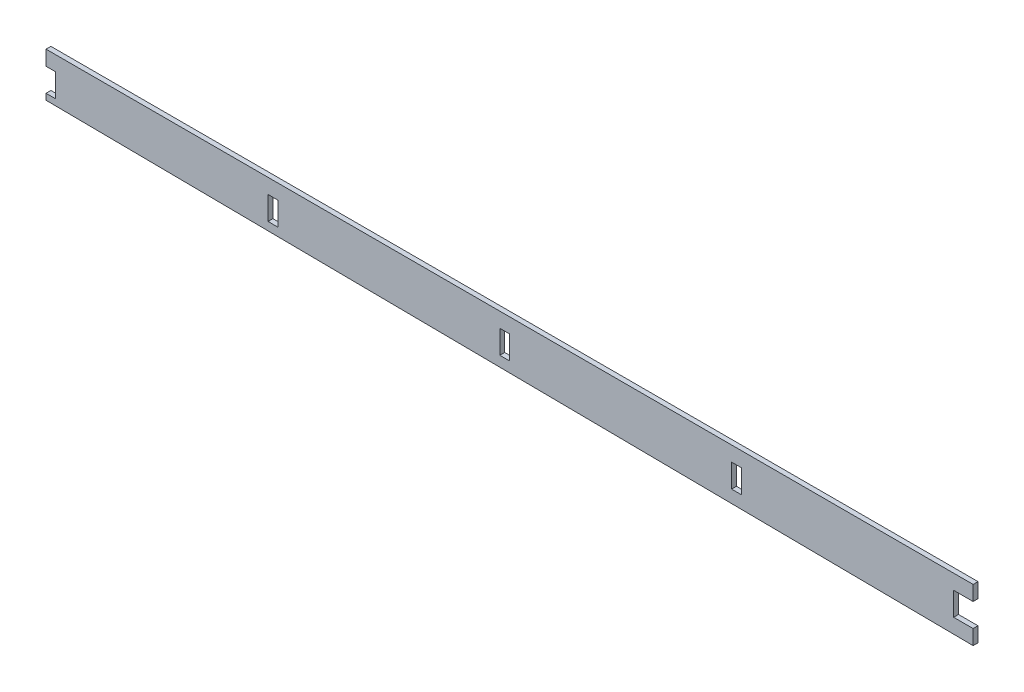
ISO-10303-21;
HEADER;
FILE_DESCRIPTION(('STEP AP214'),'2;1');
FILE_NAME('part.step','',(''),(''),'','','');
FILE_SCHEMA(('AUTOMOTIVE_DESIGN { 1 0 10303 214 1 1 1 1 }'));
ENDSEC;
DATA;
#1=APPLICATION_CONTEXT('core data for automotive mechanical design processes');
#2=APPLICATION_PROTOCOL_DEFINITION('international standard','automotive_design',2000,#1);
#3=PRODUCT_CONTEXT('',#1,'mechanical');
#4=PRODUCT('Part','Part','',(#3));
#5=PRODUCT_RELATED_PRODUCT_CATEGORY('part','',(#4));
#6=PRODUCT_DEFINITION_FORMATION('','',#4);
#7=PRODUCT_DEFINITION_CONTEXT('part definition',#1,'design');
#8=PRODUCT_DEFINITION('design','',#6,#7);
#9=PRODUCT_DEFINITION_SHAPE('','',#8);
#10=(LENGTH_UNIT() NAMED_UNIT(*) SI_UNIT(.MILLI.,.METRE.));
#11=(NAMED_UNIT(*) PLANE_ANGLE_UNIT() SI_UNIT($,.RADIAN.));
#12=(NAMED_UNIT(*) SI_UNIT($,.STERADIAN.) SOLID_ANGLE_UNIT());
#13=UNCERTAINTY_MEASURE_WITH_UNIT(LENGTH_MEASURE(1.E-05),#10,'distance_accuracy_value','');
#14=(GEOMETRIC_REPRESENTATION_CONTEXT(3) GLOBAL_UNCERTAINTY_ASSIGNED_CONTEXT((#13)) GLOBAL_UNIT_ASSIGNED_CONTEXT((#10,
#11,#12)) REPRESENTATION_CONTEXT('',''));
#15=CARTESIAN_POINT('',(0.,0.,0.));
#16=DIRECTION('',(0.,0.,1.));
#17=DIRECTION('',(1.,0.,0.));
#18=AXIS2_PLACEMENT_3D('',#15,#16,#17);
#19=CARTESIAN_POINT('',(0.,0.,1.5875));
#20=DIRECTION('',(0.,0.,-1.));
#21=DIRECTION('',(-1.,0.,0.));
#22=AXIS2_PLACEMENT_3D('',#19,#20,#21);
#23=PLANE('',#22);
#24=DIRECTION('',(0.,-1.,0.));
#25=VECTOR('',#24,1.);
#26=CARTESIAN_POINT('',(-65.9792565693098,-35.892525905535,1.5875));
#27=LINE('',#26,#25);
#28=CARTESIAN_POINT('',(-65.9792565693098,-35.892525905535,1.5875));
#29=VERTEX_POINT('',#28);
#30=CARTESIAN_POINT('',(-65.9792565693099,-43.512525905535,1.5875));
#31=VERTEX_POINT('',#30);
#32=EDGE_CURVE('E229',#29,#31,#27,.T.);
#33=ORIENTED_EDGE('',*,*,#32,.F.);
#34=DIRECTION('',(-1.,0.,0.));
#35=VECTOR('',#34,1.);
#36=CARTESIAN_POINT('',(-62.8042565693099,-35.892525905535,1.5875));
#37=LINE('',#36,#35);
#38=CARTESIAN_POINT('',(-62.8042565693099,-35.892525905535,1.5875));
#39=VERTEX_POINT('',#38);
#40=EDGE_CURVE('E237',#39,#29,#37,.T.);
#41=ORIENTED_EDGE('',*,*,#40,.F.);
#42=DIRECTION('',(0.,1.,0.));
#43=VECTOR('',#42,1.);
#44=CARTESIAN_POINT('',(-62.8042565693098,-43.512525905535,1.5875));
#45=LINE('',#44,#43);
#46=CARTESIAN_POINT('',(-62.8042565693098,-43.512525905535,1.5875));
#47=VERTEX_POINT('',#46);
#48=EDGE_CURVE('E234',#47,#39,#45,.T.);
#49=ORIENTED_EDGE('',*,*,#48,.F.);
#50=DIRECTION('',(1.,0.,0.));
#51=VECTOR('',#50,1.);
#52=CARTESIAN_POINT('',(-65.9792565693099,-43.512525905535,1.5875));
#53=LINE('',#52,#51);
#54=EDGE_CURVE('E231',#31,#47,#53,.T.);
#55=ORIENTED_EDGE('',*,*,#54,.F.);
#56=EDGE_LOOP('',(#33,#41,#49,#55));
#57=FACE_BOUND('',#56,.T.);
#58=DIRECTION('',(-1.,0.,0.));
#59=VECTOR('',#58,1.);
#60=CARTESIAN_POINT('',(81.9757434306901,-43.512525905535,1.5875));
#61=LINE('',#60,#59);
#62=CARTESIAN_POINT('',(88.3257434306901,-43.512525905535,1.5875));
#63=VERTEX_POINT('',#62);
#64=CARTESIAN_POINT('',(81.9757434306901,-43.512525905535,1.5875));
#65=VERTEX_POINT('',#64);
#66=EDGE_CURVE('E291',#63,#65,#61,.T.);
#67=ORIENTED_EDGE('',*,*,#66,.T.);
#68=DIRECTION('',(0.,1.,0.));
#69=VECTOR('',#68,1.);
#70=CARTESIAN_POINT('',(81.9757434306901,-43.512525905535,1.5875));
#71=LINE('',#70,#69);
#72=CARTESIAN_POINT('',(81.9757434306901,-35.892525905535,1.5875));
#73=VERTEX_POINT('',#72);
#74=EDGE_CURVE('E294',#65,#73,#71,.T.);
#75=ORIENTED_EDGE('',*,*,#74,.T.);
#76=DIRECTION('',(1.,0.,0.));
#77=VECTOR('',#76,1.);
#78=CARTESIAN_POINT('',(81.9757434306901,-35.892525905535,1.5875));
#79=LINE('',#78,#77);
#80=CARTESIAN_POINT('',(88.3257434306901,-35.892525905535,1.5875));
#81=VERTEX_POINT('',#80);
#82=EDGE_CURVE('E297',#73,#81,#79,.T.);
#83=ORIENTED_EDGE('',*,*,#82,.T.);
#84=DIRECTION('',(0.,1.,0.));
#85=VECTOR('',#84,1.);
#86=CARTESIAN_POINT('',(88.3257434306901,-35.892525905535,1.5875));
#87=LINE('',#86,#85);
#88=CARTESIAN_POINT('',(88.3257434306901,-31.0535940441647,1.5875));
#89=VERTEX_POINT('',#88);
#90=EDGE_CURVE('E299',#81,#89,#87,.T.);
#91=ORIENTED_EDGE('',*,*,#90,.T.);
#92=DIRECTION('',(-1.,0.,0.));
#93=VECTOR('',#92,1.);
#94=CARTESIAN_POINT('',(88.3257434306901,-31.0535940441647,1.5875));
#95=LINE('',#94,#93);
#96=CARTESIAN_POINT('',(-213.93425656931,-31.0535940441647,1.5875));
#97=VERTEX_POINT('',#96);
#98=EDGE_CURVE('E301',#89,#97,#95,.T.);
#99=ORIENTED_EDGE('',*,*,#98,.T.);
#100=DIRECTION('',(0.,-1.,0.));
#101=VECTOR('',#100,1.);
#102=CARTESIAN_POINT('',(-213.93425656931,-35.892525905535,1.5875));
#103=LINE('',#102,#101);
#104=CARTESIAN_POINT('',(-213.93425656931,-35.892525905535,1.5875));
#105=VERTEX_POINT('',#104);
#106=EDGE_CURVE('E303',#97,#105,#103,.T.);
#107=ORIENTED_EDGE('',*,*,#106,.T.);
#108=DIRECTION('',(1.,0.,0.));
#109=VECTOR('',#108,1.);
#110=CARTESIAN_POINT('',(-210.75925656931,-35.892525905535,1.5875));
#111=LINE('',#110,#109);
#112=CARTESIAN_POINT('',(-210.75925656931,-35.892525905535,1.5875));
#113=VERTEX_POINT('',#112);
#114=EDGE_CURVE('E305',#105,#113,#111,.T.);
#115=ORIENTED_EDGE('',*,*,#114,.T.);
#116=DIRECTION('',(0.,-1.,0.));
#117=VECTOR('',#116,1.);
#118=CARTESIAN_POINT('',(-210.75925656931,-43.512525905535,1.5875));
#119=LINE('',#118,#117);
#120=CARTESIAN_POINT('',(-210.75925656931,-43.512525905535,1.5875));
#121=VERTEX_POINT('',#120);
#122=EDGE_CURVE('E307',#113,#121,#119,.T.);
#123=ORIENTED_EDGE('',*,*,#122,.T.);
#124=DIRECTION('',(-1.,0.,0.));
#125=VECTOR('',#124,1.);
#126=CARTESIAN_POINT('',(-213.93425656931,-43.512525905535,1.5875));
#127=LINE('',#126,#125);
#128=CARTESIAN_POINT('',(-213.93425656931,-43.512525905535,1.5875));
#129=VERTEX_POINT('',#128);
#130=EDGE_CURVE('E309',#121,#129,#127,.T.);
#131=ORIENTED_EDGE('',*,*,#130,.T.);
#132=DIRECTION('',(1.12806988141054E-13,-1.,0.));
#133=VECTOR('',#132,1.);
#134=CARTESIAN_POINT('',(-213.93425656931,-45.480884502676,1.5875));
#135=LINE('',#134,#133);
#136=CARTESIAN_POINT('',(-213.93425656931,-45.480884502676,1.5875));
#137=VERTEX_POINT('',#136);
#138=EDGE_CURVE('E311',#129,#137,#135,.T.);
#139=ORIENTED_EDGE('',*,*,#138,.T.);
#140=DIRECTION('',(0.999954907890458,-0.00949643016011447,0.));
#141=VECTOR('',#140,1.);
#142=CARTESIAN_POINT('',(88.3257434306901,-48.3514049206934,1.5875));
#143=LINE('',#142,#141);
#144=CARTESIAN_POINT('',(88.3257434306901,-48.3514049206934,1.5875));
#145=VERTEX_POINT('',#144);
#146=EDGE_CURVE('E313',#137,#145,#143,.T.);
#147=ORIENTED_EDGE('',*,*,#146,.T.);
#148=DIRECTION('',(0.,1.,0.));
#149=VECTOR('',#148,1.);
#150=CARTESIAN_POINT('',(88.3257434306901,-43.512525905535,1.5875));
#151=LINE('',#150,#149);
#152=EDGE_CURVE('E315',#145,#63,#151,.T.);
#153=ORIENTED_EDGE('',*,*,#152,.T.);
#154=EDGE_LOOP('',(#67,#75,#83,#91,#99,#107,#115,#123,#131,#139,#147,#153));
#155=FACE_BOUND('',#154,.T.);
#156=DIRECTION('',(1.,0.,0.));
#157=VECTOR('',#156,1.);
#158=CARTESIAN_POINT('',(9.5857434306901,-43.512525905535,1.5875));
#159=LINE('',#158,#157);
#160=CARTESIAN_POINT('',(9.5857434306901,-43.512525905535,1.5875));
#161=VERTEX_POINT('',#160);
#162=CARTESIAN_POINT('',(12.7607434306901,-43.512525905535,1.5875));
#163=VERTEX_POINT('',#162);
#164=EDGE_CURVE('E260',#161,#163,#159,.T.);
#165=ORIENTED_EDGE('',*,*,#164,.F.);
#166=DIRECTION('',(0.,-1.,0.));
#167=VECTOR('',#166,1.);
#168=CARTESIAN_POINT('',(9.5857434306901,-35.892525905535,1.5875));
#169=LINE('',#168,#167);
#170=CARTESIAN_POINT('',(9.5857434306901,-35.892525905535,1.5875));
#171=VERTEX_POINT('',#170);
#172=EDGE_CURVE('E268',#171,#161,#169,.T.);
#173=ORIENTED_EDGE('',*,*,#172,.F.);
#174=DIRECTION('',(-1.,0.,0.));
#175=VECTOR('',#174,1.);
#176=CARTESIAN_POINT('',(12.7607434306901,-35.8925259055349,1.5875));
#177=LINE('',#176,#175);
#178=CARTESIAN_POINT('',(12.7607434306901,-35.8925259055349,1.5875));
#179=VERTEX_POINT('',#178);
#180=EDGE_CURVE('E265',#179,#171,#177,.T.);
#181=ORIENTED_EDGE('',*,*,#180,.F.);
#182=DIRECTION('',(0.,1.,0.));
#183=VECTOR('',#182,1.);
#184=CARTESIAN_POINT('',(12.7607434306901,-43.512525905535,1.5875));
#185=LINE('',#184,#183);
#186=EDGE_CURVE('E262',#163,#179,#185,.T.);
#187=ORIENTED_EDGE('',*,*,#186,.F.);
#188=EDGE_LOOP('',(#165,#173,#181,#187));
#189=FACE_BOUND('',#188,.T.);
#190=DIRECTION('',(0.,-1.,0.));
#191=VECTOR('',#190,1.);
#192=CARTESIAN_POINT('',(-141.54425656931,-35.892525905535,1.5875));
#193=LINE('',#192,#191);
#194=CARTESIAN_POINT('',(-141.54425656931,-35.892525905535,1.5875));
#195=VERTEX_POINT('',#194);
#196=CARTESIAN_POINT('',(-141.54425656931,-43.512525905535,1.5875));
#197=VERTEX_POINT('',#196);
#198=EDGE_CURVE('E193',#195,#197,#193,.T.);
#199=ORIENTED_EDGE('',*,*,#198,.F.);
#200=DIRECTION('',(-1.,0.,0.));
#201=VECTOR('',#200,1.);
#202=CARTESIAN_POINT('',(-138.36925656931,-35.892525905535,1.5875));
#203=LINE('',#202,#201);
#204=CARTESIAN_POINT('',(-138.36925656931,-35.892525905535,1.5875));
#205=VERTEX_POINT('',#204);
#206=EDGE_CURVE('E215',#205,#195,#203,.T.);
#207=ORIENTED_EDGE('',*,*,#206,.F.);
#208=DIRECTION('',(0.,1.,0.));
#209=VECTOR('',#208,1.);
#210=CARTESIAN_POINT('',(-138.36925656931,-43.512525905535,1.5875));
#211=LINE('',#210,#209);
#212=CARTESIAN_POINT('',(-138.36925656931,-43.512525905535,1.5875));
#213=VERTEX_POINT('',#212);
#214=EDGE_CURVE('E213',#213,#205,#211,.T.);
#215=ORIENTED_EDGE('',*,*,#214,.F.);
#216=DIRECTION('',(1.,0.,0.));
#217=VECTOR('',#216,1.);
#218=CARTESIAN_POINT('',(-141.54425656931,-43.512525905535,1.5875));
#219=LINE('',#218,#217);
#220=EDGE_CURVE('E201',#197,#213,#219,.T.);
#221=ORIENTED_EDGE('',*,*,#220,.F.);
#222=EDGE_LOOP('',(#199,#207,#215,#221));
#223=FACE_BOUND('',#222,.T.);
#224=ADVANCED_FACE('F32',(#57,#155,#189,#223),#23,.F.);
#225=CARTESIAN_POINT('',(0.,0.,0.));
#226=DIRECTION('',(0.,0.,-1.));
#227=DIRECTION('',(-1.,0.,0.));
#228=AXIS2_PLACEMENT_3D('',#225,#226,#227);
#229=PLANE('',#228);
#230=DIRECTION('',(-1.,0.,0.));
#231=VECTOR('',#230,1.);
#232=CARTESIAN_POINT('',(81.9757434306901,-43.512525905535,0.));
#233=LINE('',#232,#231);
#234=CARTESIAN_POINT('',(88.3257434306901,-43.512525905535,0.));
#235=VERTEX_POINT('',#234);
#236=CARTESIAN_POINT('',(81.9757434306901,-43.512525905535,0.));
#237=VERTEX_POINT('',#236);
#238=EDGE_CURVE('E290',#235,#237,#233,.T.);
#239=ORIENTED_EDGE('',*,*,#238,.F.);
#240=DIRECTION('',(0.,1.,0.));
#241=VECTOR('',#240,1.);
#242=CARTESIAN_POINT('',(88.3257434306901,-43.512525905535,0.));
#243=LINE('',#242,#241);
#244=CARTESIAN_POINT('',(88.3257434306901,-48.3514049206934,0.));
#245=VERTEX_POINT('',#244);
#246=EDGE_CURVE('E295',#245,#235,#243,.T.);
#247=ORIENTED_EDGE('',*,*,#246,.F.);
#248=DIRECTION('',(0.999954907890458,-0.00949643016011447,0.));
#249=VECTOR('',#248,1.);
#250=CARTESIAN_POINT('',(88.3257434306901,-48.3514049206934,0.));
#251=LINE('',#250,#249);
#252=CARTESIAN_POINT('',(-213.93425656931,-45.480884502676,0.));
#253=VERTEX_POINT('',#252);
#254=EDGE_CURVE('E338',#253,#245,#251,.T.);
#255=ORIENTED_EDGE('',*,*,#254,.F.);
#256=DIRECTION('',(1.12806988141054E-13,-1.,0.));
#257=VECTOR('',#256,1.);
#258=CARTESIAN_POINT('',(-213.93425656931,-45.480884502676,0.));
#259=LINE('',#258,#257);
#260=CARTESIAN_POINT('',(-213.93425656931,-43.512525905535,0.));
#261=VERTEX_POINT('',#260);
#262=EDGE_CURVE('E336',#261,#253,#259,.T.);
#263=ORIENTED_EDGE('',*,*,#262,.F.);
#264=DIRECTION('',(-1.,0.,0.));
#265=VECTOR('',#264,1.);
#266=CARTESIAN_POINT('',(-213.93425656931,-43.512525905535,0.));
#267=LINE('',#266,#265);
#268=CARTESIAN_POINT('',(-210.75925656931,-43.512525905535,0.));
#269=VERTEX_POINT('',#268);
#270=EDGE_CURVE('E334',#269,#261,#267,.T.);
#271=ORIENTED_EDGE('',*,*,#270,.F.);
#272=DIRECTION('',(0.,-1.,0.));
#273=VECTOR('',#272,1.);
#274=CARTESIAN_POINT('',(-210.75925656931,-43.512525905535,0.));
#275=LINE('',#274,#273);
#276=CARTESIAN_POINT('',(-210.75925656931,-35.892525905535,0.));
#277=VERTEX_POINT('',#276);
#278=EDGE_CURVE('E332',#277,#269,#275,.T.);
#279=ORIENTED_EDGE('',*,*,#278,.F.);
#280=DIRECTION('',(1.,0.,0.));
#281=VECTOR('',#280,1.);
#282=CARTESIAN_POINT('',(-210.75925656931,-35.892525905535,0.));
#283=LINE('',#282,#281);
#284=CARTESIAN_POINT('',(-213.93425656931,-35.892525905535,0.));
#285=VERTEX_POINT('',#284);
#286=EDGE_CURVE('E330',#285,#277,#283,.T.);
#287=ORIENTED_EDGE('',*,*,#286,.F.);
#288=DIRECTION('',(0.,-1.,0.));
#289=VECTOR('',#288,1.);
#290=CARTESIAN_POINT('',(-213.93425656931,-35.892525905535,0.));
#291=LINE('',#290,#289);
#292=CARTESIAN_POINT('',(-213.93425656931,-31.0535940441647,0.));
#293=VERTEX_POINT('',#292);
#294=EDGE_CURVE('E328',#293,#285,#291,.T.);
#295=ORIENTED_EDGE('',*,*,#294,.F.);
#296=DIRECTION('',(-1.,0.,0.));
#297=VECTOR('',#296,1.);
#298=CARTESIAN_POINT('',(88.3257434306901,-31.0535940441647,0.));
#299=LINE('',#298,#297);
#300=CARTESIAN_POINT('',(88.3257434306901,-31.0535940441647,0.));
#301=VERTEX_POINT('',#300);
#302=EDGE_CURVE('E326',#301,#293,#299,.T.);
#303=ORIENTED_EDGE('',*,*,#302,.F.);
#304=DIRECTION('',(0.,1.,0.));
#305=VECTOR('',#304,1.);
#306=CARTESIAN_POINT('',(88.3257434306901,-35.892525905535,0.));
#307=LINE('',#306,#305);
#308=CARTESIAN_POINT('',(88.3257434306901,-35.892525905535,0.));
#309=VERTEX_POINT('',#308);
#310=EDGE_CURVE('E324',#309,#301,#307,.T.);
#311=ORIENTED_EDGE('',*,*,#310,.F.);
#312=DIRECTION('',(1.,0.,0.));
#313=VECTOR('',#312,1.);
#314=CARTESIAN_POINT('',(81.9757434306901,-35.892525905535,0.));
#315=LINE('',#314,#313);
#316=CARTESIAN_POINT('',(81.9757434306901,-35.892525905535,0.));
#317=VERTEX_POINT('',#316);
#318=EDGE_CURVE('E322',#317,#309,#315,.T.);
#319=ORIENTED_EDGE('',*,*,#318,.F.);
#320=DIRECTION('',(0.,1.,0.));
#321=VECTOR('',#320,1.);
#322=CARTESIAN_POINT('',(81.9757434306901,-43.512525905535,0.));
#323=LINE('',#322,#321);
#324=EDGE_CURVE('E320',#237,#317,#323,.T.);
#325=ORIENTED_EDGE('',*,*,#324,.F.);
#326=EDGE_LOOP('',(#239,#247,#255,#263,#271,#279,#287,#295,#303,#311,#319,#325));
#327=FACE_BOUND('',#326,.T.);
#328=DIRECTION('',(0.,-1.,0.));
#329=VECTOR('',#328,1.);
#330=CARTESIAN_POINT('',(9.5857434306901,-35.892525905535,0.));
#331=LINE('',#330,#329);
#332=CARTESIAN_POINT('',(9.5857434306901,-35.892525905535,0.));
#333=VERTEX_POINT('',#332);
#334=CARTESIAN_POINT('',(9.5857434306901,-43.512525905535,0.));
#335=VERTEX_POINT('',#334);
#336=EDGE_CURVE('E263',#333,#335,#331,.T.);
#337=ORIENTED_EDGE('',*,*,#336,.T.);
#338=DIRECTION('',(1.,0.,0.));
#339=VECTOR('',#338,1.);
#340=CARTESIAN_POINT('',(9.5857434306901,-43.512525905535,0.));
#341=LINE('',#340,#339);
#342=CARTESIAN_POINT('',(12.7607434306901,-43.512525905535,0.));
#343=VERTEX_POINT('',#342);
#344=EDGE_CURVE('E259',#335,#343,#341,.T.);
#345=ORIENTED_EDGE('',*,*,#344,.T.);
#346=DIRECTION('',(0.,1.,0.));
#347=VECTOR('',#346,1.);
#348=CARTESIAN_POINT('',(12.7607434306901,-43.512525905535,0.));
#349=LINE('',#348,#347);
#350=CARTESIAN_POINT('',(12.7607434306901,-35.8925259055349,0.));
#351=VERTEX_POINT('',#350);
#352=EDGE_CURVE('E273',#343,#351,#349,.T.);
#353=ORIENTED_EDGE('',*,*,#352,.T.);
#354=DIRECTION('',(-1.,0.,0.));
#355=VECTOR('',#354,1.);
#356=CARTESIAN_POINT('',(12.7607434306901,-35.8925259055349,0.));
#357=LINE('',#356,#355);
#358=EDGE_CURVE('E276',#351,#333,#357,.T.);
#359=ORIENTED_EDGE('',*,*,#358,.T.);
#360=EDGE_LOOP('',(#337,#345,#353,#359));
#361=FACE_BOUND('',#360,.T.);
#362=DIRECTION('',(-1.,0.,0.));
#363=VECTOR('',#362,1.);
#364=CARTESIAN_POINT('',(-62.8042565693099,-35.892525905535,0.));
#365=LINE('',#364,#363);
#366=CARTESIAN_POINT('',(-62.8042565693099,-35.892525905535,0.));
#367=VERTEX_POINT('',#366);
#368=CARTESIAN_POINT('',(-65.9792565693098,-35.892525905535,0.));
#369=VERTEX_POINT('',#368);
#370=EDGE_CURVE('E232',#367,#369,#365,.T.);
#371=ORIENTED_EDGE('',*,*,#370,.T.);
#372=DIRECTION('',(0.,-1.,0.));
#373=VECTOR('',#372,1.);
#374=CARTESIAN_POINT('',(-65.9792565693098,-35.892525905535,0.));
#375=LINE('',#374,#373);
#376=CARTESIAN_POINT('',(-65.9792565693099,-43.512525905535,0.));
#377=VERTEX_POINT('',#376);
#378=EDGE_CURVE('E209',#369,#377,#375,.T.);
#379=ORIENTED_EDGE('',*,*,#378,.T.);
#380=DIRECTION('',(1.,0.,0.));
#381=VECTOR('',#380,1.);
#382=CARTESIAN_POINT('',(-65.9792565693099,-43.512525905535,0.));
#383=LINE('',#382,#381);
#384=CARTESIAN_POINT('',(-62.8042565693098,-43.512525905535,0.));
#385=VERTEX_POINT('',#384);
#386=EDGE_CURVE('E242',#377,#385,#383,.T.);
#387=ORIENTED_EDGE('',*,*,#386,.T.);
#388=DIRECTION('',(0.,1.,0.));
#389=VECTOR('',#388,1.);
#390=CARTESIAN_POINT('',(-62.8042565693098,-43.512525905535,0.));
#391=LINE('',#390,#389);
#392=EDGE_CURVE('E245',#385,#367,#391,.T.);
#393=ORIENTED_EDGE('',*,*,#392,.T.);
#394=EDGE_LOOP('',(#371,#379,#387,#393));
#395=FACE_BOUND('',#394,.T.);
#396=DIRECTION('',(-1.,0.,0.));
#397=VECTOR('',#396,1.);
#398=CARTESIAN_POINT('',(-138.36925656931,-35.892525905535,0.));
#399=LINE('',#398,#397);
#400=CARTESIAN_POINT('',(-138.36925656931,-35.892525905535,0.));
#401=VERTEX_POINT('',#400);
#402=CARTESIAN_POINT('',(-141.54425656931,-35.892525905535,0.));
#403=VERTEX_POINT('',#402);
#404=EDGE_CURVE('E202',#401,#403,#399,.T.);
#405=ORIENTED_EDGE('',*,*,#404,.T.);
#406=DIRECTION('',(0.,-1.,0.));
#407=VECTOR('',#406,1.);
#408=CARTESIAN_POINT('',(-141.54425656931,-35.892525905535,0.));
#409=LINE('',#408,#407);
#410=CARTESIAN_POINT('',(-141.54425656931,-43.512525905535,0.));
#411=VERTEX_POINT('',#410);
#412=EDGE_CURVE('E55',#403,#411,#409,.T.);
#413=ORIENTED_EDGE('',*,*,#412,.T.);
#414=DIRECTION('',(1.,0.,0.));
#415=VECTOR('',#414,1.);
#416=CARTESIAN_POINT('',(-141.54425656931,-43.512525905535,0.));
#417=LINE('',#416,#415);
#418=CARTESIAN_POINT('',(-138.36925656931,-43.512525905535,0.));
#419=VERTEX_POINT('',#418);
#420=EDGE_CURVE('E208',#411,#419,#417,.T.);
#421=ORIENTED_EDGE('',*,*,#420,.T.);
#422=DIRECTION('',(0.,1.,0.));
#423=VECTOR('',#422,1.);
#424=CARTESIAN_POINT('',(-138.36925656931,-43.512525905535,0.));
#425=LINE('',#424,#423);
#426=EDGE_CURVE('E221',#419,#401,#425,.T.);
#427=ORIENTED_EDGE('',*,*,#426,.T.);
#428=EDGE_LOOP('',(#405,#413,#421,#427));
#429=FACE_BOUND('',#428,.T.);
#430=ADVANCED_FACE('F380',(#327,#361,#395,#429),#229,.T.);
#431=CARTESIAN_POINT('',(81.9757434306901,-43.512525905535,1.5875));
#432=DIRECTION('',(0.,-1.,0.));
#433=DIRECTION('',(1.,0.,0.));
#434=AXIS2_PLACEMENT_3D('',#431,#432,#433);
#435=PLANE('',#434);
#436=ORIENTED_EDGE('',*,*,#238,.T.);
#437=DIRECTION('',(0.,0.,-1.));
#438=VECTOR('',#437,1.);
#439=CARTESIAN_POINT('',(81.9757434306901,-43.512525905535,1.5875));
#440=LINE('',#439,#438);
#441=EDGE_CURVE('E11',#65,#237,#440,.T.);
#442=ORIENTED_EDGE('',*,*,#441,.F.);
#443=ORIENTED_EDGE('',*,*,#66,.F.);
#444=DIRECTION('',(0.,0.,-1.));
#445=VECTOR('',#444,1.);
#446=CARTESIAN_POINT('',(88.3257434306901,-43.512525905535,1.5875));
#447=LINE('',#446,#445);
#448=EDGE_CURVE('E317',#63,#235,#447,.T.);
#449=ORIENTED_EDGE('',*,*,#448,.T.);
#450=EDGE_LOOP('',(#436,#442,#443,#449));
#451=FACE_BOUND('',#450,.T.);
#452=ADVANCED_FACE('F34',(#451),#435,.F.);
#453=CARTESIAN_POINT('',(81.9757434306901,-43.512525905535,1.5875));
#454=DIRECTION('',(-1.,0.,0.));
#455=DIRECTION('',(0.,0.,1.));
#456=AXIS2_PLACEMENT_3D('',#453,#454,#455);
#457=PLANE('',#456);
#458=ORIENTED_EDGE('',*,*,#324,.T.);
#459=DIRECTION('',(0.,0.,-1.));
#460=VECTOR('',#459,1.);
#461=CARTESIAN_POINT('',(81.9757434306901,-35.892525905535,1.5875));
#462=LINE('',#461,#460);
#463=EDGE_CURVE('E40',#73,#317,#462,.T.);
#464=ORIENTED_EDGE('',*,*,#463,.F.);
#465=ORIENTED_EDGE('',*,*,#74,.F.);
#466=ORIENTED_EDGE('',*,*,#441,.T.);
#467=EDGE_LOOP('',(#458,#464,#465,#466));
#468=FACE_BOUND('',#467,.T.);
#469=ADVANCED_FACE('F398',(#468),#457,.F.);
#470=CARTESIAN_POINT('',(81.9757434306901,-35.892525905535,1.5875));
#471=DIRECTION('',(0.,1.,0.));
#472=DIRECTION('',(0.,0.,1.));
#473=AXIS2_PLACEMENT_3D('',#470,#471,#472);
#474=PLANE('',#473);
#475=ORIENTED_EDGE('',*,*,#318,.T.);
#476=DIRECTION('',(0.,0.,-1.));
#477=VECTOR('',#476,1.);
#478=CARTESIAN_POINT('',(88.3257434306901,-35.892525905535,1.5875));
#479=LINE('',#478,#477);
#480=EDGE_CURVE('E367',#81,#309,#479,.T.);
#481=ORIENTED_EDGE('',*,*,#480,.F.);
#482=ORIENTED_EDGE('',*,*,#82,.F.);
#483=ORIENTED_EDGE('',*,*,#463,.T.);
#484=EDGE_LOOP('',(#475,#481,#482,#483));
#485=FACE_BOUND('',#484,.T.);
#486=ADVANCED_FACE('F374',(#485),#474,.F.);
#487=CARTESIAN_POINT('',(88.3257434306901,-35.892525905535,1.5875));
#488=DIRECTION('',(-1.,0.,0.));
#489=DIRECTION('',(0.,0.,1.));
#490=AXIS2_PLACEMENT_3D('',#487,#488,#489);
#491=PLANE('',#490);
#492=ORIENTED_EDGE('',*,*,#310,.T.);
#493=DIRECTION('',(0.,0.,-1.));
#494=VECTOR('',#493,1.);
#495=CARTESIAN_POINT('',(88.3257434306901,-31.0535940441647,1.5875));
#496=LINE('',#495,#494);
#497=EDGE_CURVE('E364',#89,#301,#496,.T.);
#498=ORIENTED_EDGE('',*,*,#497,.F.);
#499=ORIENTED_EDGE('',*,*,#90,.F.);
#500=ORIENTED_EDGE('',*,*,#480,.T.);
#501=EDGE_LOOP('',(#492,#498,#499,#500));
#502=FACE_BOUND('',#501,.T.);
#503=ADVANCED_FACE('F386',(#502),#491,.F.);
#504=CARTESIAN_POINT('',(88.3257434306901,-31.0535940441647,1.5875));
#505=DIRECTION('',(0.,-1.,0.));
#506=DIRECTION('',(1.,0.,0.));
#507=AXIS2_PLACEMENT_3D('',#504,#505,#506);
#508=PLANE('',#507);
#509=ORIENTED_EDGE('',*,*,#302,.T.);
#510=DIRECTION('',(0.,0.,-1.));
#511=VECTOR('',#510,1.);
#512=CARTESIAN_POINT('',(-213.93425656931,-31.0535940441647,1.5875));
#513=LINE('',#512,#511);
#514=EDGE_CURVE('E361',#97,#293,#513,.T.);
#515=ORIENTED_EDGE('',*,*,#514,.F.);
#516=ORIENTED_EDGE('',*,*,#98,.F.);
#517=ORIENTED_EDGE('',*,*,#497,.T.);
#518=EDGE_LOOP('',(#509,#515,#516,#517));
#519=FACE_BOUND('',#518,.T.);
#520=ADVANCED_FACE('F390',(#519),#508,.F.);
#521=CARTESIAN_POINT('',(-213.93425656931,-35.892525905535,1.5875));
#522=DIRECTION('',(1.,0.,0.));
#523=DIRECTION('',(0.,0.,-1.));
#524=AXIS2_PLACEMENT_3D('',#521,#522,#523);
#525=PLANE('',#524);
#526=ORIENTED_EDGE('',*,*,#294,.T.);
#527=DIRECTION('',(0.,0.,-1.));
#528=VECTOR('',#527,1.);
#529=CARTESIAN_POINT('',(-213.93425656931,-35.892525905535,1.5875));
#530=LINE('',#529,#528);
#531=EDGE_CURVE('E358',#105,#285,#530,.T.);
#532=ORIENTED_EDGE('',*,*,#531,.F.);
#533=ORIENTED_EDGE('',*,*,#106,.F.);
#534=ORIENTED_EDGE('',*,*,#514,.T.);
#535=EDGE_LOOP('',(#526,#532,#533,#534));
#536=FACE_BOUND('',#535,.T.);
#537=ADVANCED_FACE('F431',(#536),#525,.F.);
#538=CARTESIAN_POINT('',(-210.75925656931,-35.892525905535,1.5875));
#539=DIRECTION('',(0.,1.,0.));
#540=DIRECTION('',(-1.,0.,0.));
#541=AXIS2_PLACEMENT_3D('',#538,#539,#540);
#542=PLANE('',#541);
#543=ORIENTED_EDGE('',*,*,#286,.T.);
#544=DIRECTION('',(0.,0.,-1.));
#545=VECTOR('',#544,1.);
#546=CARTESIAN_POINT('',(-210.75925656931,-35.892525905535,1.5875));
#547=LINE('',#546,#545);
#548=EDGE_CURVE('E355',#113,#277,#547,.T.);
#549=ORIENTED_EDGE('',*,*,#548,.F.);
#550=ORIENTED_EDGE('',*,*,#114,.F.);
#551=ORIENTED_EDGE('',*,*,#531,.T.);
#552=EDGE_LOOP('',(#543,#549,#550,#551));
#553=FACE_BOUND('',#552,.T.);
#554=ADVANCED_FACE('F429',(#553),#542,.F.);
#555=CARTESIAN_POINT('',(-210.75925656931,-43.512525905535,1.5875));
#556=DIRECTION('',(1.,0.,0.));
#557=DIRECTION('',(0.,1.,0.));
#558=AXIS2_PLACEMENT_3D('',#555,#556,#557);
#559=PLANE('',#558);
#560=ORIENTED_EDGE('',*,*,#278,.T.);
#561=DIRECTION('',(0.,0.,-1.));
#562=VECTOR('',#561,1.);
#563=CARTESIAN_POINT('',(-210.75925656931,-43.512525905535,1.5875));
#564=LINE('',#563,#562);
#565=EDGE_CURVE('E352',#121,#269,#564,.T.);
#566=ORIENTED_EDGE('',*,*,#565,.F.);
#567=ORIENTED_EDGE('',*,*,#122,.F.);
#568=ORIENTED_EDGE('',*,*,#548,.T.);
#569=EDGE_LOOP('',(#560,#566,#567,#568));
#570=FACE_BOUND('',#569,.T.);
#571=ADVANCED_FACE('F425',(#570),#559,.F.);
#572=CARTESIAN_POINT('',(-213.93425656931,-43.512525905535,1.5875));
#573=DIRECTION('',(0.,-1.,0.));
#574=DIRECTION('',(1.,0.,0.));
#575=AXIS2_PLACEMENT_3D('',#572,#573,#574);
#576=PLANE('',#575);
#577=ORIENTED_EDGE('',*,*,#270,.T.);
#578=DIRECTION('',(0.,0.,-1.));
#579=VECTOR('',#578,1.);
#580=CARTESIAN_POINT('',(-213.93425656931,-43.512525905535,1.5875));
#581=LINE('',#580,#579);
#582=EDGE_CURVE('E349',#129,#261,#581,.T.);
#583=ORIENTED_EDGE('',*,*,#582,.F.);
#584=ORIENTED_EDGE('',*,*,#130,.F.);
#585=ORIENTED_EDGE('',*,*,#565,.T.);
#586=EDGE_LOOP('',(#577,#583,#584,#585));
#587=FACE_BOUND('',#586,.T.);
#588=ADVANCED_FACE('F420',(#587),#576,.F.);
#589=CARTESIAN_POINT('',(-213.93425656931,-45.480884502676,1.5875));
#590=DIRECTION('',(1.,1.12806988141054E-13,0.));
#591=DIRECTION('',(-1.12806988141054E-13,1.,0.));
#592=AXIS2_PLACEMENT_3D('',#589,#590,#591);
#593=PLANE('',#592);
#594=ORIENTED_EDGE('',*,*,#262,.T.);
#595=DIRECTION('',(0.,0.,-1.));
#596=VECTOR('',#595,1.);
#597=CARTESIAN_POINT('',(-213.93425656931,-45.480884502676,1.5875));
#598=LINE('',#597,#596);
#599=EDGE_CURVE('E346',#137,#253,#598,.T.);
#600=ORIENTED_EDGE('',*,*,#599,.F.);
#601=ORIENTED_EDGE('',*,*,#138,.F.);
#602=ORIENTED_EDGE('',*,*,#582,.T.);
#603=EDGE_LOOP('',(#594,#600,#601,#602));
#604=FACE_BOUND('',#603,.T.);
#605=ADVANCED_FACE('F414',(#604),#593,.F.);
#606=CARTESIAN_POINT('',(88.3257434306901,-48.3514049206934,1.5875));
#607=DIRECTION('',(0.00949643016011447,0.999954907890458,0.));
#608=DIRECTION('',(-0.999954907890458,0.00949643016011447,0.));
#609=AXIS2_PLACEMENT_3D('',#606,#607,#608);
#610=PLANE('',#609);
#611=ORIENTED_EDGE('',*,*,#254,.T.);
#612=DIRECTION('',(0.,0.,-1.));
#613=VECTOR('',#612,1.);
#614=CARTESIAN_POINT('',(88.3257434306901,-48.3514049206934,1.5875));
#615=LINE('',#614,#613);
#616=EDGE_CURVE('E343',#145,#245,#615,.T.);
#617=ORIENTED_EDGE('',*,*,#616,.F.);
#618=ORIENTED_EDGE('',*,*,#146,.F.);
#619=ORIENTED_EDGE('',*,*,#599,.T.);
#620=EDGE_LOOP('',(#611,#617,#618,#619));
#621=FACE_BOUND('',#620,.T.);
#622=ADVANCED_FACE('F410',(#621),#610,.F.);
#623=CARTESIAN_POINT('',(88.3257434306901,-43.512525905535,1.5875));
#624=DIRECTION('',(-1.,0.,0.));
#625=DIRECTION('',(0.,0.,1.));
#626=AXIS2_PLACEMENT_3D('',#623,#624,#625);
#627=PLANE('',#626);
#628=ORIENTED_EDGE('',*,*,#246,.T.);
#629=ORIENTED_EDGE('',*,*,#448,.F.);
#630=ORIENTED_EDGE('',*,*,#152,.F.);
#631=ORIENTED_EDGE('',*,*,#616,.T.);
#632=EDGE_LOOP('',(#628,#629,#630,#631));
#633=FACE_BOUND('',#632,.T.);
#634=ADVANCED_FACE('F405',(#633),#627,.F.);
#635=CARTESIAN_POINT('',(9.5857434306901,-43.512525905535,1.5875));
#636=DIRECTION('',(0.,1.,0.));
#637=DIRECTION('',(0.,0.,1.));
#638=AXIS2_PLACEMENT_3D('',#635,#636,#637);
#639=PLANE('',#638);
#640=ORIENTED_EDGE('',*,*,#344,.F.);
#641=DIRECTION('',(0.,0.,-1.));
#642=VECTOR('',#641,1.);
#643=CARTESIAN_POINT('',(9.5857434306901,-43.512525905535,1.5875));
#644=LINE('',#643,#642);
#645=EDGE_CURVE('E270',#161,#335,#644,.T.);
#646=ORIENTED_EDGE('',*,*,#645,.F.);
#647=ORIENTED_EDGE('',*,*,#164,.T.);
#648=DIRECTION('',(0.,0.,-1.));
#649=VECTOR('',#648,1.);
#650=CARTESIAN_POINT('',(12.7607434306901,-43.512525905535,1.5875));
#651=LINE('',#650,#649);
#652=EDGE_CURVE('E287',#163,#343,#651,.T.);
#653=ORIENTED_EDGE('',*,*,#652,.T.);
#654=EDGE_LOOP('',(#640,#646,#647,#653));
#655=FACE_BOUND('',#654,.T.);
#656=ADVANCED_FACE('F449',(#655),#639,.T.);
#657=CARTESIAN_POINT('',(12.7607434306901,-43.512525905535,1.5875));
#658=DIRECTION('',(-1.,0.,0.));
#659=DIRECTION('',(0.,0.,1.));
#660=AXIS2_PLACEMENT_3D('',#657,#658,#659);
#661=PLANE('',#660);
#662=ORIENTED_EDGE('',*,*,#352,.F.);
#663=ORIENTED_EDGE('',*,*,#652,.F.);
#664=ORIENTED_EDGE('',*,*,#186,.T.);
#665=DIRECTION('',(0.,0.,-1.));
#666=VECTOR('',#665,1.);
#667=CARTESIAN_POINT('',(12.7607434306901,-35.8925259055349,1.5875));
#668=LINE('',#667,#666);
#669=EDGE_CURVE('E285',#179,#351,#668,.T.);
#670=ORIENTED_EDGE('',*,*,#669,.T.);
#671=EDGE_LOOP('',(#662,#663,#664,#670));
#672=FACE_BOUND('',#671,.T.);
#673=ADVANCED_FACE('F487',(#672),#661,.T.);
#674=CARTESIAN_POINT('',(12.7607434306901,-35.8925259055349,1.5875));
#675=DIRECTION('',(0.,-1.,0.));
#676=DIRECTION('',(1.,0.,0.));
#677=AXIS2_PLACEMENT_3D('',#674,#675,#676);
#678=PLANE('',#677);
#679=ORIENTED_EDGE('',*,*,#358,.F.);
#680=ORIENTED_EDGE('',*,*,#669,.F.);
#681=ORIENTED_EDGE('',*,*,#180,.T.);
#682=DIRECTION('',(0.,0.,-1.));
#683=VECTOR('',#682,1.);
#684=CARTESIAN_POINT('',(9.5857434306901,-35.892525905535,1.5875));
#685=LINE('',#684,#683);
#686=EDGE_CURVE('E283',#171,#333,#685,.T.);
#687=ORIENTED_EDGE('',*,*,#686,.T.);
#688=EDGE_LOOP('',(#679,#680,#681,#687));
#689=FACE_BOUND('',#688,.T.);
#690=ADVANCED_FACE('F494',(#689),#678,.T.);
#691=CARTESIAN_POINT('',(9.5857434306901,-35.892525905535,1.5875));
#692=DIRECTION('',(1.,0.,0.));
#693=DIRECTION('',(0.,1.,0.));
#694=AXIS2_PLACEMENT_3D('',#691,#692,#693);
#695=PLANE('',#694);
#696=ORIENTED_EDGE('',*,*,#336,.F.);
#697=ORIENTED_EDGE('',*,*,#686,.F.);
#698=ORIENTED_EDGE('',*,*,#172,.T.);
#699=ORIENTED_EDGE('',*,*,#645,.T.);
#700=EDGE_LOOP('',(#696,#697,#698,#699));
#701=FACE_BOUND('',#700,.T.);
#702=ADVANCED_FACE('F501',(#701),#695,.T.);
#703=CARTESIAN_POINT('',(-65.9792565693098,-35.892525905535,1.5875));
#704=DIRECTION('',(1.,0.,0.));
#705=DIRECTION('',(0.,1.,0.));
#706=AXIS2_PLACEMENT_3D('',#703,#704,#705);
#707=PLANE('',#706);
#708=ORIENTED_EDGE('',*,*,#378,.F.);
#709=DIRECTION('',(0.,0.,-1.));
#710=VECTOR('',#709,1.);
#711=CARTESIAN_POINT('',(-65.9792565693098,-35.892525905535,1.5875));
#712=LINE('',#711,#710);
#713=EDGE_CURVE('E239',#29,#369,#712,.T.);
#714=ORIENTED_EDGE('',*,*,#713,.F.);
#715=ORIENTED_EDGE('',*,*,#32,.T.);
#716=DIRECTION('',(0.,0.,-1.));
#717=VECTOR('',#716,1.);
#718=CARTESIAN_POINT('',(-65.9792565693099,-43.512525905535,1.5875));
#719=LINE('',#718,#717);
#720=EDGE_CURVE('E256',#31,#377,#719,.T.);
#721=ORIENTED_EDGE('',*,*,#720,.T.);
#722=EDGE_LOOP('',(#708,#714,#715,#721));
#723=FACE_BOUND('',#722,.T.);
#724=ADVANCED_FACE('F509',(#723),#707,.T.);
#725=CARTESIAN_POINT('',(-65.9792565693099,-43.512525905535,1.5875));
#726=DIRECTION('',(0.,1.,0.));
#727=DIRECTION('',(-1.,0.,0.));
#728=AXIS2_PLACEMENT_3D('',#725,#726,#727);
#729=PLANE('',#728);
#730=ORIENTED_EDGE('',*,*,#386,.F.);
#731=ORIENTED_EDGE('',*,*,#720,.F.);
#732=ORIENTED_EDGE('',*,*,#54,.T.);
#733=DIRECTION('',(0.,0.,-1.));
#734=VECTOR('',#733,1.);
#735=CARTESIAN_POINT('',(-62.8042565693098,-43.512525905535,1.5875));
#736=LINE('',#735,#734);
#737=EDGE_CURVE('E254',#47,#385,#736,.T.);
#738=ORIENTED_EDGE('',*,*,#737,.T.);
#739=EDGE_LOOP('',(#730,#731,#732,#738));
#740=FACE_BOUND('',#739,.T.);
#741=ADVANCED_FACE('F517',(#740),#729,.T.);
#742=CARTESIAN_POINT('',(-62.8042565693098,-43.512525905535,1.5875));
#743=DIRECTION('',(-1.,0.,0.));
#744=DIRECTION('',(0.,-1.,0.));
#745=AXIS2_PLACEMENT_3D('',#742,#743,#744);
#746=PLANE('',#745);
#747=ORIENTED_EDGE('',*,*,#392,.F.);
#748=ORIENTED_EDGE('',*,*,#737,.F.);
#749=ORIENTED_EDGE('',*,*,#48,.T.);
#750=DIRECTION('',(0.,0.,-1.));
#751=VECTOR('',#750,1.);
#752=CARTESIAN_POINT('',(-62.8042565693099,-35.892525905535,1.5875));
#753=LINE('',#752,#751);
#754=EDGE_CURVE('E252',#39,#367,#753,.T.);
#755=ORIENTED_EDGE('',*,*,#754,.T.);
#756=EDGE_LOOP('',(#747,#748,#749,#755));
#757=FACE_BOUND('',#756,.T.);
#758=ADVANCED_FACE('F525',(#757),#746,.T.);
#759=CARTESIAN_POINT('',(-62.8042565693099,-35.892525905535,1.5875));
#760=DIRECTION('',(0.,-1.,0.));
#761=DIRECTION('',(1.,0.,0.));
#762=AXIS2_PLACEMENT_3D('',#759,#760,#761);
#763=PLANE('',#762);
#764=ORIENTED_EDGE('',*,*,#370,.F.);
#765=ORIENTED_EDGE('',*,*,#754,.F.);
#766=ORIENTED_EDGE('',*,*,#40,.T.);
#767=ORIENTED_EDGE('',*,*,#713,.T.);
#768=EDGE_LOOP('',(#764,#765,#766,#767));
#769=FACE_BOUND('',#768,.T.);
#770=ADVANCED_FACE('F533',(#769),#763,.T.);
#771=CARTESIAN_POINT('',(-141.54425656931,-35.892525905535,1.5875));
#772=DIRECTION('',(1.,0.,0.));
#773=DIRECTION('',(0.,1.,0.));
#774=AXIS2_PLACEMENT_3D('',#771,#772,#773);
#775=PLANE('',#774);
#776=ORIENTED_EDGE('',*,*,#412,.F.);
#777=DIRECTION('',(0.,0.,-1.));
#778=VECTOR('',#777,1.);
#779=CARTESIAN_POINT('',(-141.54425656931,-35.892525905535,1.5875));
#780=LINE('',#779,#778);
#781=EDGE_CURVE('E197',#195,#403,#780,.T.);
#782=ORIENTED_EDGE('',*,*,#781,.F.);
#783=ORIENTED_EDGE('',*,*,#198,.T.);
#784=DIRECTION('',(0.,0.,-1.));
#785=VECTOR('',#784,1.);
#786=CARTESIAN_POINT('',(-141.54425656931,-43.512525905535,1.5875));
#787=LINE('',#786,#785);
#788=EDGE_CURVE('E196',#197,#411,#787,.T.);
#789=ORIENTED_EDGE('',*,*,#788,.T.);
#790=EDGE_LOOP('',(#776,#782,#783,#789));
#791=FACE_BOUND('',#790,.T.);
#792=ADVANCED_FACE('F195',(#791),#775,.T.);
#793=CARTESIAN_POINT('',(-141.54425656931,-43.512525905535,1.5875));
#794=DIRECTION('',(0.,1.,0.));
#795=DIRECTION('',(-1.,0.,0.));
#796=AXIS2_PLACEMENT_3D('',#793,#794,#795);
#797=PLANE('',#796);
#798=ORIENTED_EDGE('',*,*,#420,.F.);
#799=ORIENTED_EDGE('',*,*,#788,.F.);
#800=ORIENTED_EDGE('',*,*,#220,.T.);
#801=DIRECTION('',(0.,0.,-1.));
#802=VECTOR('',#801,1.);
#803=CARTESIAN_POINT('',(-138.36925656931,-43.512525905535,1.5875));
#804=LINE('',#803,#802);
#805=EDGE_CURVE('E210',#213,#419,#804,.T.);
#806=ORIENTED_EDGE('',*,*,#805,.T.);
#807=EDGE_LOOP('',(#798,#799,#800,#806));
#808=FACE_BOUND('',#807,.T.);
#809=ADVANCED_FACE('F205',(#808),#797,.T.);
#810=CARTESIAN_POINT('',(-138.36925656931,-43.512525905535,1.5875));
#811=DIRECTION('',(-1.,0.,0.));
#812=DIRECTION('',(0.,-1.,0.));
#813=AXIS2_PLACEMENT_3D('',#810,#811,#812);
#814=PLANE('',#813);
#815=ORIENTED_EDGE('',*,*,#426,.F.);
#816=ORIENTED_EDGE('',*,*,#805,.F.);
#817=ORIENTED_EDGE('',*,*,#214,.T.);
#818=DIRECTION('',(0.,0.,-1.));
#819=VECTOR('',#818,1.);
#820=CARTESIAN_POINT('',(-138.36925656931,-35.892525905535,1.5875));
#821=LINE('',#820,#819);
#822=EDGE_CURVE('E47',#205,#401,#821,.T.);
#823=ORIENTED_EDGE('',*,*,#822,.T.);
#824=EDGE_LOOP('',(#815,#816,#817,#823));
#825=FACE_BOUND('',#824,.T.);
#826=ADVANCED_FACE('F554',(#825),#814,.T.);
#827=CARTESIAN_POINT('',(-138.36925656931,-35.892525905535,1.5875));
#828=DIRECTION('',(0.,-1.,0.));
#829=DIRECTION('',(1.,0.,0.));
#830=AXIS2_PLACEMENT_3D('',#827,#828,#829);
#831=PLANE('',#830);
#832=ORIENTED_EDGE('',*,*,#404,.F.);
#833=ORIENTED_EDGE('',*,*,#822,.F.);
#834=ORIENTED_EDGE('',*,*,#206,.T.);
#835=ORIENTED_EDGE('',*,*,#781,.T.);
#836=EDGE_LOOP('',(#832,#833,#834,#835));
#837=FACE_BOUND('',#836,.T.);
#838=ADVANCED_FACE('F561',(#837),#831,.T.);
#839=CLOSED_SHELL('',(#224,#430,#452,#469,#486,#503,#520,#537,#554,#571,#588,#605,#622,#634,
#656,#673,#690,#702,#724,#741,#758,#770,#792,#809,#826,#838));
#840=MANIFOLD_SOLID_BREP('B2',#839);
#841=ADVANCED_BREP_SHAPE_REPRESENTATION('',(#18,#840),#14);
#842=SHAPE_DEFINITION_REPRESENTATION(#9,#841);
ENDSEC;
END-ISO-10303-21;
